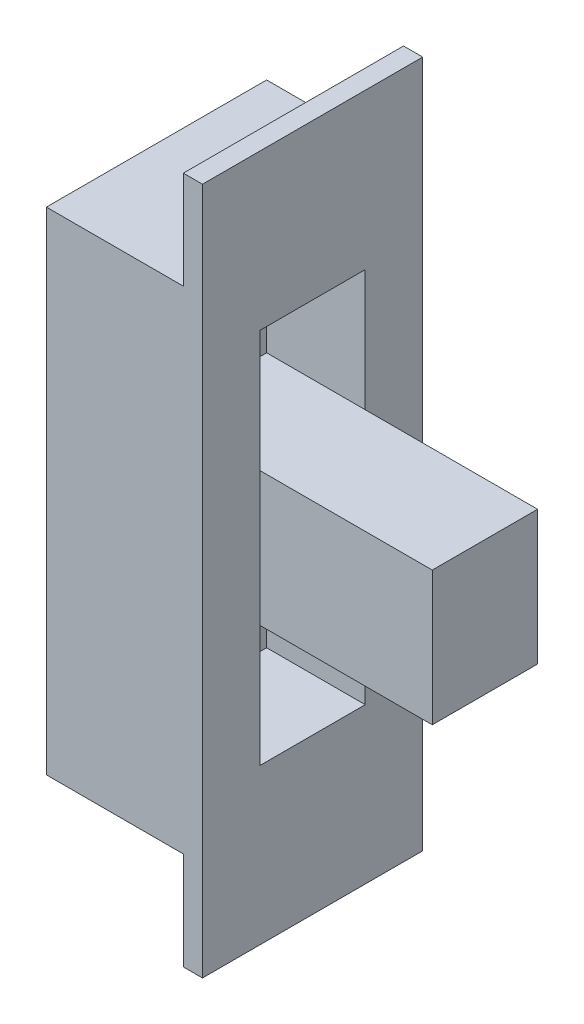
ISO-10303-21;
HEADER;
FILE_DESCRIPTION(('STEP AP214'),'2;1');
FILE_NAME('part.step','',(''),(''),'','','');
FILE_SCHEMA(('AUTOMOTIVE_DESIGN { 1 0 10303 214 1 1 1 1 }'));
ENDSEC;
DATA;
#1=APPLICATION_CONTEXT('core data for automotive mechanical design processes');
#2=APPLICATION_PROTOCOL_DEFINITION('international standard','automotive_design',2000,#1);
#3=PRODUCT_CONTEXT('',#1,'mechanical');
#4=PRODUCT('Part','Part','',(#3));
#5=PRODUCT_RELATED_PRODUCT_CATEGORY('part','',(#4));
#6=PRODUCT_DEFINITION_FORMATION('','',#4);
#7=PRODUCT_DEFINITION_CONTEXT('part definition',#1,'design');
#8=PRODUCT_DEFINITION('design','',#6,#7);
#9=PRODUCT_DEFINITION_SHAPE('','',#8);
#10=(LENGTH_UNIT() NAMED_UNIT(*) SI_UNIT(.MILLI.,.METRE.));
#11=(NAMED_UNIT(*) PLANE_ANGLE_UNIT() SI_UNIT($,.RADIAN.));
#12=(NAMED_UNIT(*) SI_UNIT($,.STERADIAN.) SOLID_ANGLE_UNIT());
#13=UNCERTAINTY_MEASURE_WITH_UNIT(LENGTH_MEASURE(1.E-05),#10,'distance_accuracy_value','');
#14=(GEOMETRIC_REPRESENTATION_CONTEXT(3) GLOBAL_UNCERTAINTY_ASSIGNED_CONTEXT((#13)) GLOBAL_UNIT_ASSIGNED_CONTEXT((#10,
#11,#12)) REPRESENTATION_CONTEXT('',''));
#15=CARTESIAN_POINT('',(0.,0.,0.));
#16=DIRECTION('',(0.,0.,1.));
#17=DIRECTION('',(1.,0.,0.));
#18=AXIS2_PLACEMENT_3D('',#15,#16,#17);
#19=CARTESIAN_POINT('',(-35.8250258301707,28.9408534637666,8.5));
#20=DIRECTION('',(0.,0.,-1.));
#21=DIRECTION('',(-1.,0.,0.));
#22=AXIS2_PLACEMENT_3D('',#19,#20,#21);
#23=PLANE('',#22);
#24=DIRECTION('',(0.,1.,0.));
#25=VECTOR('',#24,1.);
#26=CARTESIAN_POINT('',(-12.3925708076852,28.9408534637666,8.5));
#27=LINE('',#26,#25);
#28=CARTESIAN_POINT('',(-12.3925708076852,28.9408534637666,8.5));
#29=VERTEX_POINT('',#28);
#30=CARTESIAN_POINT('',(-12.3925708076852,35.2793865139848,8.5));
#31=VERTEX_POINT('',#30);
#32=EDGE_CURVE('E233',#29,#31,#27,.T.);
#33=ORIENTED_EDGE('',*,*,#32,.T.);
#34=DIRECTION('',(-1.,0.,0.));
#35=VECTOR('',#34,1.);
#36=CARTESIAN_POINT('',(10.6596760996972,35.2793865139848,8.5));
#37=LINE('',#36,#35);
#38=CARTESIAN_POINT('',(-7.24257080768518,35.2793865139848,8.5));
#39=VERTEX_POINT('',#38);
#40=EDGE_CURVE('E62',#39,#31,#37,.T.);
#41=ORIENTED_EDGE('',*,*,#40,.F.);
#42=DIRECTION('',(0.,1.,0.));
#43=VECTOR('',#42,1.);
#44=CARTESIAN_POINT('',(-7.24257080768518,28.9408534637666,8.5));
#45=LINE('',#44,#43);
#46=CARTESIAN_POINT('',(-7.24257080768518,28.9408534637666,8.5));
#47=VERTEX_POINT('',#46);
#48=EDGE_CURVE('E223',#47,#39,#45,.T.);
#49=ORIENTED_EDGE('',*,*,#48,.F.);
#50=DIRECTION('',(1.,0.,0.));
#51=VECTOR('',#50,1.);
#52=CARTESIAN_POINT('',(-35.8250258301707,28.9408534637666,8.5));
#53=LINE('',#52,#51);
#54=EDGE_CURVE('E228',#29,#47,#53,.T.);
#55=ORIENTED_EDGE('',*,*,#54,.F.);
#56=EDGE_LOOP('',(#33,#41,#49,#55));
#57=FACE_BOUND('',#56,.T.);
#58=ADVANCED_FACE('F39',(#57),#23,.T.);
#59=CARTESIAN_POINT('',(-35.8250258301707,48.6191465362334,3.));
#60=DIRECTION('',(0.,0.,1.));
#61=DIRECTION('',(1.,0.,0.));
#62=AXIS2_PLACEMENT_3D('',#59,#60,#61);
#63=PLANE('',#62);
#64=DIRECTION('',(0.,-1.,0.));
#65=VECTOR('',#64,1.);
#66=CARTESIAN_POINT('',(-7.24257080768518,48.6191465362334,3.));
#67=LINE('',#66,#65);
#68=CARTESIAN_POINT('',(-7.24257080768518,35.2793865139848,3.));
#69=VERTEX_POINT('',#68);
#70=CARTESIAN_POINT('',(-7.24257080768518,28.9408534637666,3.));
#71=VERTEX_POINT('',#70);
#72=EDGE_CURVE('E217',#69,#71,#67,.T.);
#73=ORIENTED_EDGE('',*,*,#72,.F.);
#74=DIRECTION('',(-1.,0.,0.));
#75=VECTOR('',#74,1.);
#76=CARTESIAN_POINT('',(10.6596760996972,35.2793865139848,3.));
#77=LINE('',#76,#75);
#78=CARTESIAN_POINT('',(-12.3925708076852,35.2793865139848,3.));
#79=VERTEX_POINT('',#78);
#80=EDGE_CURVE('E186',#69,#79,#77,.T.);
#81=ORIENTED_EDGE('',*,*,#80,.T.);
#82=DIRECTION('',(0.,-1.,0.));
#83=VECTOR('',#82,1.);
#84=CARTESIAN_POINT('',(-12.3925708076852,48.6191465362334,3.));
#85=LINE('',#84,#83);
#86=CARTESIAN_POINT('',(-12.3925708076852,28.9408534637666,3.));
#87=VERTEX_POINT('',#86);
#88=EDGE_CURVE('E216',#79,#87,#85,.T.);
#89=ORIENTED_EDGE('',*,*,#88,.T.);
#90=DIRECTION('',(1.,0.,0.));
#91=VECTOR('',#90,1.);
#92=CARTESIAN_POINT('',(-35.8250258301707,28.9408534637666,3.));
#93=LINE('',#92,#91);
#94=EDGE_CURVE('E212',#87,#71,#93,.T.);
#95=ORIENTED_EDGE('',*,*,#94,.T.);
#96=EDGE_LOOP('',(#73,#81,#89,#95));
#97=FACE_BOUND('',#96,.T.);
#98=ADVANCED_FACE('F366',(#97),#63,.T.);
#99=CARTESIAN_POINT('',(-12.3925708076852,25.9408534637666,0.));
#100=DIRECTION('',(-1.,0.,0.));
#101=DIRECTION('',(0.,0.,1.));
#102=AXIS2_PLACEMENT_3D('',#99,#100,#101);
#103=PLANE('',#102);
#104=DIRECTION('',(0.,0.,-1.));
#105=VECTOR('',#104,1.);
#106=CARTESIAN_POINT('',(-12.3925708076852,35.2793865139848,8.5));
#107=LINE('',#106,#105);
#108=EDGE_CURVE('E198',#31,#79,#107,.T.);
#109=ORIENTED_EDGE('',*,*,#108,.F.);
#110=ORIENTED_EDGE('',*,*,#32,.F.);
#111=DIRECTION('',(0.,0.,1.));
#112=VECTOR('',#111,1.);
#113=CARTESIAN_POINT('',(-12.3925708076852,28.9408534637666,3.));
#114=LINE('',#113,#112);
#115=EDGE_CURVE('E236',#87,#29,#114,.T.);
#116=ORIENTED_EDGE('',*,*,#115,.F.);
#117=ORIENTED_EDGE('',*,*,#88,.F.);
#118=EDGE_LOOP('',(#109,#110,#116,#117));
#119=FACE_BOUND('',#118,.T.);
#120=ADVANCED_FACE('F339',(#119),#103,.F.);
#121=CARTESIAN_POINT('',(-7.24257080768518,56.73,11.5));
#122=DIRECTION('',(1.,0.,0.));
#123=DIRECTION('',(0.,0.,-1.));
#124=AXIS2_PLACEMENT_3D('',#121,#122,#123);
#125=PLANE('',#124);
#126=DIRECTION('',(0.,-1.,0.));
#127=VECTOR('',#126,1.);
#128=CARTESIAN_POINT('',(-7.24257080768518,56.73,0.));
#129=LINE('',#128,#127);
#130=CARTESIAN_POINT('',(-7.24257080768518,56.73,0.));
#131=VERTEX_POINT('',#130);
#132=CARTESIAN_POINT('',(-7.24257080768518,20.83,0.));
#133=VERTEX_POINT('',#132);
#134=EDGE_CURVE('E278',#131,#133,#129,.T.);
#135=ORIENTED_EDGE('',*,*,#134,.F.);
#136=DIRECTION('',(0.,0.,-1.));
#137=VECTOR('',#136,1.);
#138=CARTESIAN_POINT('',(-7.24257080768518,56.73,11.5));
#139=LINE('',#138,#137);
#140=CARTESIAN_POINT('',(-7.24257080768518,56.73,11.5));
#141=VERTEX_POINT('',#140);
#142=EDGE_CURVE('E286',#141,#131,#139,.T.);
#143=ORIENTED_EDGE('',*,*,#142,.F.);
#144=DIRECTION('',(0.,-1.,0.));
#145=VECTOR('',#144,1.);
#146=CARTESIAN_POINT('',(-7.24257080768518,56.73,11.5));
#147=LINE('',#146,#145);
#148=CARTESIAN_POINT('',(-7.24257080768518,20.83,11.5));
#149=VERTEX_POINT('',#148);
#150=EDGE_CURVE('E283',#141,#149,#147,.T.);
#151=ORIENTED_EDGE('',*,*,#150,.T.);
#152=DIRECTION('',(0.,0.,-1.));
#153=VECTOR('',#152,1.);
#154=CARTESIAN_POINT('',(-7.24257080768518,20.83,11.5));
#155=LINE('',#154,#153);
#156=EDGE_CURVE('E299',#149,#133,#155,.T.);
#157=ORIENTED_EDGE('',*,*,#156,.T.);
#158=EDGE_LOOP('',(#135,#143,#151,#157));
#159=FACE_BOUND('',#158,.T.);
#160=CARTESIAN_POINT('',(-7.24257080768518,48.6191465362334,3.));
#161=VERTEX_POINT('',#160);
#162=CARTESIAN_POINT('',(-7.24257080768518,42.2793865139848,3.));
#163=VERTEX_POINT('',#162);
#164=EDGE_CURVE('E213',#161,#163,#67,.T.);
#165=ORIENTED_EDGE('',*,*,#164,.T.);
#166=DIRECTION('',(0.,-1.,0.));
#167=VECTOR('',#166,1.);
#168=CARTESIAN_POINT('',(-7.24257080768518,56.73,3.));
#169=LINE('',#168,#167);
#170=EDGE_CURVE('E183',#163,#69,#169,.T.);
#171=ORIENTED_EDGE('',*,*,#170,.T.);
#172=ORIENTED_EDGE('',*,*,#72,.T.);
#173=DIRECTION('',(0.,0.,1.));
#174=VECTOR('',#173,1.);
#175=CARTESIAN_POINT('',(-7.24257080768518,28.9408534637666,3.));
#176=LINE('',#175,#174);
#177=EDGE_CURVE('E225',#71,#47,#176,.T.);
#178=ORIENTED_EDGE('',*,*,#177,.T.);
#179=ORIENTED_EDGE('',*,*,#48,.T.);
#180=DIRECTION('',(0.,1.,0.));
#181=VECTOR('',#180,1.);
#182=CARTESIAN_POINT('',(-7.24257080768518,56.73,8.5));
#183=LINE('',#182,#181);
#184=CARTESIAN_POINT('',(-7.24257080768518,42.2793865139848,8.5));
#185=VERTEX_POINT('',#184);
#186=EDGE_CURVE('E208',#39,#185,#183,.T.);
#187=ORIENTED_EDGE('',*,*,#186,.T.);
#188=CARTESIAN_POINT('',(-7.24257080768518,48.6191465362334,8.5));
#189=VERTEX_POINT('',#188);
#190=EDGE_CURVE('E54',#185,#189,#45,.T.);
#191=ORIENTED_EDGE('',*,*,#190,.T.);
#192=DIRECTION('',(0.,0.,-1.));
#193=VECTOR('',#192,1.);
#194=CARTESIAN_POINT('',(-7.24257080768518,48.6191465362334,8.5));
#195=LINE('',#194,#193);
#196=EDGE_CURVE('E218',#189,#161,#195,.T.);
#197=ORIENTED_EDGE('',*,*,#196,.T.);
#198=EDGE_LOOP('',(#165,#171,#172,#178,#179,#187,#191,#197));
#199=FACE_BOUND('',#198,.T.);
#200=ADVANCED_FACE('F336',(#159,#199),#125,.T.);
#201=CARTESIAN_POINT('',(-8.24257080768518,20.83,11.5));
#202=DIRECTION('',(-1.,0.,0.));
#203=DIRECTION('',(0.,0.,1.));
#204=AXIS2_PLACEMENT_3D('',#201,#202,#203);
#205=PLANE('',#204);
#206=DIRECTION('',(0.,1.,0.));
#207=VECTOR('',#206,1.);
#208=CARTESIAN_POINT('',(-8.24257080768518,20.83,0.));
#209=LINE('',#208,#207);
#210=CARTESIAN_POINT('',(-8.24257080768518,51.6191465362334,0.));
#211=VERTEX_POINT('',#210);
#212=CARTESIAN_POINT('',(-8.24257080768518,56.73,0.));
#213=VERTEX_POINT('',#212);
#214=EDGE_CURVE('E289',#211,#213,#209,.T.);
#215=ORIENTED_EDGE('',*,*,#214,.F.);
#216=DIRECTION('',(0.,0.,1.));
#217=VECTOR('',#216,1.);
#218=CARTESIAN_POINT('',(-8.24257080768518,51.6191465362334,0.));
#219=LINE('',#218,#217);
#220=CARTESIAN_POINT('',(-8.24257080768518,51.6191465362334,11.5));
#221=VERTEX_POINT('',#220);
#222=EDGE_CURVE('E251',#211,#221,#219,.T.);
#223=ORIENTED_EDGE('',*,*,#222,.T.);
#224=DIRECTION('',(0.,1.,0.));
#225=VECTOR('',#224,1.);
#226=CARTESIAN_POINT('',(-8.24257080768518,20.83,11.5));
#227=LINE('',#226,#225);
#228=CARTESIAN_POINT('',(-8.24257080768518,56.73,11.5));
#229=VERTEX_POINT('',#228);
#230=EDGE_CURVE('E277',#221,#229,#227,.T.);
#231=ORIENTED_EDGE('',*,*,#230,.T.);
#232=DIRECTION('',(0.,0.,-1.));
#233=VECTOR('',#232,1.);
#234=CARTESIAN_POINT('',(-8.24257080768518,56.73,11.5));
#235=LINE('',#234,#233);
#236=EDGE_CURVE('E12',#229,#213,#235,.T.);
#237=ORIENTED_EDGE('',*,*,#236,.T.);
#238=EDGE_LOOP('',(#215,#223,#231,#237));
#239=FACE_BOUND('',#238,.T.);
#240=ADVANCED_FACE('F330',(#239),#205,.T.);
#241=CARTESIAN_POINT('',(-7.24257080768518,56.73,11.5));
#242=DIRECTION('',(0.,-1.,0.));
#243=DIRECTION('',(0.,0.,-1.));
#244=AXIS2_PLACEMENT_3D('',#241,#242,#243);
#245=PLANE('',#244);
#246=DIRECTION('',(-1.,0.,0.));
#247=VECTOR('',#246,1.);
#248=CARTESIAN_POINT('',(-7.24257080768518,56.73,0.));
#249=LINE('',#248,#247);
#250=EDGE_CURVE('E273',#131,#213,#249,.T.);
#251=ORIENTED_EDGE('',*,*,#250,.T.);
#252=ORIENTED_EDGE('',*,*,#236,.F.);
#253=DIRECTION('',(-1.,0.,0.));
#254=VECTOR('',#253,1.);
#255=CARTESIAN_POINT('',(-7.24257080768518,56.73,11.5));
#256=LINE('',#255,#254);
#257=EDGE_CURVE('E274',#141,#229,#256,.T.);
#258=ORIENTED_EDGE('',*,*,#257,.F.);
#259=ORIENTED_EDGE('',*,*,#142,.T.);
#260=EDGE_LOOP('',(#251,#252,#258,#259));
#261=FACE_BOUND('',#260,.T.);
#262=ADVANCED_FACE('F41',(#261),#245,.F.);
#263=DIRECTION('',(0.,0.,1.));
#264=VECTOR('',#263,1.);
#265=CARTESIAN_POINT('',(-8.24257080768518,25.9408534637666,0.));
#266=LINE('',#265,#264);
#267=CARTESIAN_POINT('',(-8.24257080768518,25.9408534637666,0.));
#268=VERTEX_POINT('',#267);
#269=CARTESIAN_POINT('',(-8.24257080768518,25.9408534637666,11.5));
#270=VERTEX_POINT('',#269);
#271=EDGE_CURVE('E232',#268,#270,#266,.T.);
#272=ORIENTED_EDGE('',*,*,#271,.F.);
#273=CARTESIAN_POINT('',(-8.24257080768518,20.83,0.));
#274=VERTEX_POINT('',#273);
#275=EDGE_CURVE('E290',#274,#268,#209,.T.);
#276=ORIENTED_EDGE('',*,*,#275,.F.);
#277=DIRECTION('',(0.,0.,-1.));
#278=VECTOR('',#277,1.);
#279=CARTESIAN_POINT('',(-8.24257080768518,20.83,11.5));
#280=LINE('',#279,#278);
#281=CARTESIAN_POINT('',(-8.24257080768518,20.83,11.5));
#282=VERTEX_POINT('',#281);
#283=EDGE_CURVE('E47',#282,#274,#280,.T.);
#284=ORIENTED_EDGE('',*,*,#283,.F.);
#285=EDGE_CURVE('E279',#282,#270,#227,.T.);
#286=ORIENTED_EDGE('',*,*,#285,.T.);
#287=EDGE_LOOP('',(#272,#276,#284,#286));
#288=FACE_BOUND('',#287,.T.);
#289=ADVANCED_FACE('F313',(#288),#205,.T.);
#290=CARTESIAN_POINT('',(-8.24257080768518,20.83,11.5));
#291=DIRECTION('',(0.,1.,0.));
#292=DIRECTION('',(0.,0.,1.));
#293=AXIS2_PLACEMENT_3D('',#290,#291,#292);
#294=PLANE('',#293);
#295=DIRECTION('',(1.,0.,0.));
#296=VECTOR('',#295,1.);
#297=CARTESIAN_POINT('',(-8.24257080768518,20.83,0.));
#298=LINE('',#297,#296);
#299=EDGE_CURVE('E293',#274,#133,#298,.T.);
#300=ORIENTED_EDGE('',*,*,#299,.T.);
#301=ORIENTED_EDGE('',*,*,#156,.F.);
#302=DIRECTION('',(1.,0.,0.));
#303=VECTOR('',#302,1.);
#304=CARTESIAN_POINT('',(-8.24257080768518,20.83,11.5));
#305=LINE('',#304,#303);
#306=EDGE_CURVE('E281',#282,#149,#305,.T.);
#307=ORIENTED_EDGE('',*,*,#306,.F.);
#308=ORIENTED_EDGE('',*,*,#283,.T.);
#309=EDGE_LOOP('',(#300,#301,#307,#308));
#310=FACE_BOUND('',#309,.T.);
#311=ADVANCED_FACE('F303',(#310),#294,.F.);
#312=CARTESIAN_POINT('',(-8.24257080768518,56.73,11.5));
#313=DIRECTION('',(0.,0.,-1.));
#314=DIRECTION('',(-1.,0.,0.));
#315=AXIS2_PLACEMENT_3D('',#312,#313,#314);
#316=PLANE('',#315);
#317=ORIENTED_EDGE('',*,*,#257,.T.);
#318=ORIENTED_EDGE('',*,*,#230,.F.);
#319=DIRECTION('',(1.,0.,0.));
#320=VECTOR('',#319,1.);
#321=CARTESIAN_POINT('',(-15.3925708076852,51.6191465362334,11.5));
#322=LINE('',#321,#320);
#323=CARTESIAN_POINT('',(-15.3925708076852,51.6191465362334,11.5));
#324=VERTEX_POINT('',#323);
#325=EDGE_CURVE('E264',#324,#221,#322,.T.);
#326=ORIENTED_EDGE('',*,*,#325,.F.);
#327=DIRECTION('',(0.,1.,0.));
#328=VECTOR('',#327,1.);
#329=CARTESIAN_POINT('',(-15.3925708076852,25.9408534637666,11.5));
#330=LINE('',#329,#328);
#331=CARTESIAN_POINT('',(-15.3925708076852,25.9408534637666,11.5));
#332=VERTEX_POINT('',#331);
#333=EDGE_CURVE('E253',#332,#324,#330,.T.);
#334=ORIENTED_EDGE('',*,*,#333,.F.);
#335=DIRECTION('',(1.,0.,0.));
#336=VECTOR('',#335,1.);
#337=CARTESIAN_POINT('',(-15.3925708076852,25.9408534637666,11.5));
#338=LINE('',#337,#336);
#339=EDGE_CURVE('E267',#332,#270,#338,.T.);
#340=ORIENTED_EDGE('',*,*,#339,.T.);
#341=ORIENTED_EDGE('',*,*,#285,.F.);
#342=ORIENTED_EDGE('',*,*,#306,.T.);
#343=ORIENTED_EDGE('',*,*,#150,.F.);
#344=EDGE_LOOP('',(#317,#318,#326,#334,#340,#341,#342,#343));
#345=FACE_BOUND('',#344,.T.);
#346=ADVANCED_FACE('F319',(#345),#316,.F.);
#347=CARTESIAN_POINT('',(-8.24257080768518,56.73,0.));
#348=DIRECTION('',(0.,0.,-1.));
#349=DIRECTION('',(-1.,0.,0.));
#350=AXIS2_PLACEMENT_3D('',#347,#348,#349);
#351=PLANE('',#350);
#352=ORIENTED_EDGE('',*,*,#250,.F.);
#353=ORIENTED_EDGE('',*,*,#134,.T.);
#354=ORIENTED_EDGE('',*,*,#299,.F.);
#355=ORIENTED_EDGE('',*,*,#275,.T.);
#356=DIRECTION('',(1.,0.,0.));
#357=VECTOR('',#356,1.);
#358=CARTESIAN_POINT('',(-15.3925708076852,25.9408534637666,0.));
#359=LINE('',#358,#357);
#360=CARTESIAN_POINT('',(-15.3925708076852,25.9408534637666,0.));
#361=VERTEX_POINT('',#360);
#362=EDGE_CURVE('E270',#361,#268,#359,.T.);
#363=ORIENTED_EDGE('',*,*,#362,.F.);
#364=DIRECTION('',(0.,-1.,0.));
#365=VECTOR('',#364,1.);
#366=CARTESIAN_POINT('',(-15.3925708076852,51.6191465362334,0.));
#367=LINE('',#366,#365);
#368=CARTESIAN_POINT('',(-15.3925708076852,51.6191465362334,0.));
#369=VERTEX_POINT('',#368);
#370=EDGE_CURVE('E247',#369,#361,#367,.T.);
#371=ORIENTED_EDGE('',*,*,#370,.F.);
#372=DIRECTION('',(1.,0.,0.));
#373=VECTOR('',#372,1.);
#374=CARTESIAN_POINT('',(-15.3925708076852,51.6191465362334,0.));
#375=LINE('',#374,#373);
#376=EDGE_CURVE('E258',#369,#211,#375,.T.);
#377=ORIENTED_EDGE('',*,*,#376,.T.);
#378=ORIENTED_EDGE('',*,*,#214,.T.);
#379=EDGE_LOOP('',(#352,#353,#354,#355,#363,#371,#377,#378));
#380=FACE_BOUND('',#379,.T.);
#381=ADVANCED_FACE('F310',(#380),#351,.T.);
#382=CARTESIAN_POINT('',(-15.3925708076852,25.9408534637666,0.));
#383=DIRECTION('',(0.,1.,0.));
#384=DIRECTION('',(0.,0.,1.));
#385=AXIS2_PLACEMENT_3D('',#382,#383,#384);
#386=PLANE('',#385);
#387=ORIENTED_EDGE('',*,*,#271,.T.);
#388=ORIENTED_EDGE('',*,*,#339,.F.);
#389=DIRECTION('',(0.,0.,1.));
#390=VECTOR('',#389,1.);
#391=CARTESIAN_POINT('',(-15.3925708076852,25.9408534637666,0.));
#392=LINE('',#391,#390);
#393=EDGE_CURVE('E250',#361,#332,#392,.T.);
#394=ORIENTED_EDGE('',*,*,#393,.F.);
#395=ORIENTED_EDGE('',*,*,#362,.T.);
#396=EDGE_LOOP('',(#387,#388,#394,#395));
#397=FACE_BOUND('',#396,.T.);
#398=ADVANCED_FACE('F316',(#397),#386,.F.);
#399=CARTESIAN_POINT('',(-15.3925708076852,51.6191465362334,0.));
#400=DIRECTION('',(0.,1.,0.));
#401=DIRECTION('',(0.,0.,1.));
#402=AXIS2_PLACEMENT_3D('',#399,#400,#401);
#403=PLANE('',#402);
#404=ORIENTED_EDGE('',*,*,#222,.F.);
#405=ORIENTED_EDGE('',*,*,#376,.F.);
#406=DIRECTION('',(0.,0.,1.));
#407=VECTOR('',#406,1.);
#408=CARTESIAN_POINT('',(-15.3925708076852,51.6191465362334,0.));
#409=LINE('',#408,#407);
#410=EDGE_CURVE('E255',#369,#324,#409,.T.);
#411=ORIENTED_EDGE('',*,*,#410,.T.);
#412=ORIENTED_EDGE('',*,*,#325,.T.);
#413=EDGE_LOOP('',(#404,#405,#411,#412));
#414=FACE_BOUND('',#413,.T.);
#415=ADVANCED_FACE('F328',(#414),#403,.T.);
#416=CARTESIAN_POINT('',(-15.3925708076852,25.9408534637666,0.));
#417=DIRECTION('',(-1.,0.,0.));
#418=DIRECTION('',(0.,0.,1.));
#419=AXIS2_PLACEMENT_3D('',#416,#417,#418);
#420=PLANE('',#419);
#421=ORIENTED_EDGE('',*,*,#370,.T.);
#422=ORIENTED_EDGE('',*,*,#393,.T.);
#423=ORIENTED_EDGE('',*,*,#333,.T.);
#424=ORIENTED_EDGE('',*,*,#410,.F.);
#425=EDGE_LOOP('',(#421,#422,#423,#424));
#426=FACE_BOUND('',#425,.T.);
#427=ADVANCED_FACE('F324',(#426),#420,.T.);
#428=CARTESIAN_POINT('',(-35.8250258301707,28.9408534637666,3.));
#429=DIRECTION('',(0.,1.,0.));
#430=DIRECTION('',(0.,0.,1.));
#431=AXIS2_PLACEMENT_3D('',#428,#429,#430);
#432=PLANE('',#431);
#433=ORIENTED_EDGE('',*,*,#115,.T.);
#434=ORIENTED_EDGE('',*,*,#54,.T.);
#435=ORIENTED_EDGE('',*,*,#177,.F.);
#436=ORIENTED_EDGE('',*,*,#94,.F.);
#437=EDGE_LOOP('',(#433,#434,#435,#436));
#438=FACE_BOUND('',#437,.T.);
#439=ADVANCED_FACE('F364',(#438),#432,.T.);
#440=DIRECTION('',(-1.,0.,0.));
#441=VECTOR('',#440,1.);
#442=CARTESIAN_POINT('',(10.6596760996972,42.2793865139848,8.5));
#443=LINE('',#442,#441);
#444=CARTESIAN_POINT('',(-12.3925708076852,42.2793865139848,8.5));
#445=VERTEX_POINT('',#444);
#446=EDGE_CURVE('E209',#185,#445,#443,.T.);
#447=ORIENTED_EDGE('',*,*,#446,.T.);
#448=CARTESIAN_POINT('',(-12.3925708076852,48.6191465362334,8.5));
#449=VERTEX_POINT('',#448);
#450=EDGE_CURVE('E235',#445,#449,#27,.T.);
#451=ORIENTED_EDGE('',*,*,#450,.T.);
#452=DIRECTION('',(1.,0.,0.));
#453=VECTOR('',#452,1.);
#454=CARTESIAN_POINT('',(-35.8250258301707,48.6191465362334,8.5));
#455=LINE('',#454,#453);
#456=EDGE_CURVE('E222',#449,#189,#455,.T.);
#457=ORIENTED_EDGE('',*,*,#456,.T.);
#458=ORIENTED_EDGE('',*,*,#190,.F.);
#459=EDGE_LOOP('',(#447,#451,#457,#458));
#460=FACE_BOUND('',#459,.T.);
#461=ADVANCED_FACE('F353',(#460),#23,.T.);
#462=CARTESIAN_POINT('',(-35.8250258301707,48.6191465362334,8.5));
#463=DIRECTION('',(0.,-1.,0.));
#464=DIRECTION('',(0.,0.,-1.));
#465=AXIS2_PLACEMENT_3D('',#462,#463,#464);
#466=PLANE('',#465);
#467=DIRECTION('',(0.,0.,-1.));
#468=VECTOR('',#467,1.);
#469=CARTESIAN_POINT('',(-12.3925708076852,48.6191465362334,8.5));
#470=LINE('',#469,#468);
#471=CARTESIAN_POINT('',(-12.3925708076852,48.6191465362334,3.));
#472=VERTEX_POINT('',#471);
#473=EDGE_CURVE('E229',#449,#472,#470,.T.);
#474=ORIENTED_EDGE('',*,*,#473,.T.);
#475=DIRECTION('',(1.,0.,0.));
#476=VECTOR('',#475,1.);
#477=CARTESIAN_POINT('',(-35.8250258301707,48.6191465362334,3.));
#478=LINE('',#477,#476);
#479=EDGE_CURVE('E221',#472,#161,#478,.T.);
#480=ORIENTED_EDGE('',*,*,#479,.T.);
#481=ORIENTED_EDGE('',*,*,#196,.F.);
#482=ORIENTED_EDGE('',*,*,#456,.F.);
#483=EDGE_LOOP('',(#474,#480,#481,#482));
#484=FACE_BOUND('',#483,.T.);
#485=ADVANCED_FACE('F386',(#484),#466,.T.);
#486=DIRECTION('',(-1.,0.,0.));
#487=VECTOR('',#486,1.);
#488=CARTESIAN_POINT('',(10.6596760996972,42.2793865139848,3.));
#489=LINE('',#488,#487);
#490=CARTESIAN_POINT('',(-12.3925708076852,42.2793865139848,3.));
#491=VERTEX_POINT('',#490);
#492=EDGE_CURVE('E187',#163,#491,#489,.T.);
#493=ORIENTED_EDGE('',*,*,#492,.F.);
#494=ORIENTED_EDGE('',*,*,#164,.F.);
#495=ORIENTED_EDGE('',*,*,#479,.F.);
#496=EDGE_CURVE('E239',#472,#491,#85,.T.);
#497=ORIENTED_EDGE('',*,*,#496,.T.);
#498=EDGE_LOOP('',(#493,#494,#495,#497));
#499=FACE_BOUND('',#498,.T.);
#500=ADVANCED_FACE('F345',(#499),#63,.T.);
#501=ORIENTED_EDGE('',*,*,#450,.F.);
#502=DIRECTION('',(0.,0.,-1.));
#503=VECTOR('',#502,1.);
#504=CARTESIAN_POINT('',(-12.3925708076852,42.2793865139848,8.5));
#505=LINE('',#504,#503);
#506=EDGE_CURVE('E176',#445,#491,#505,.T.);
#507=ORIENTED_EDGE('',*,*,#506,.T.);
#508=ORIENTED_EDGE('',*,*,#496,.F.);
#509=ORIENTED_EDGE('',*,*,#473,.F.);
#510=EDGE_LOOP('',(#501,#507,#508,#509));
#511=FACE_BOUND('',#510,.T.);
#512=ADVANCED_FACE('F350',(#511),#103,.F.);
#513=CARTESIAN_POINT('',(1.75742919231482,56.73,11.5));
#514=DIRECTION('',(1.,0.,0.));
#515=DIRECTION('',(0.,0.,-1.));
#516=AXIS2_PLACEMENT_3D('',#513,#514,#515);
#517=PLANE('',#516);
#518=DIRECTION('',(0.,0.,-1.));
#519=VECTOR('',#518,1.);
#520=CARTESIAN_POINT('',(1.75742919231482,42.2793865139848,8.5));
#521=LINE('',#520,#519);
#522=CARTESIAN_POINT('',(1.75742919231482,42.2793865139848,8.5));
#523=VERTEX_POINT('',#522);
#524=CARTESIAN_POINT('',(1.75742919231482,42.2793865139848,3.));
#525=VERTEX_POINT('',#524);
#526=EDGE_CURVE('E169',#523,#525,#521,.T.);
#527=ORIENTED_EDGE('',*,*,#526,.F.);
#528=DIRECTION('',(0.,-1.,0.));
#529=VECTOR('',#528,1.);
#530=CARTESIAN_POINT('',(1.75742919231482,42.2793865139848,8.5));
#531=LINE('',#530,#529);
#532=CARTESIAN_POINT('',(1.75742919231482,35.2793865139848,8.5));
#533=VERTEX_POINT('',#532);
#534=EDGE_CURVE('E199',#523,#533,#531,.T.);
#535=ORIENTED_EDGE('',*,*,#534,.T.);
#536=DIRECTION('',(0.,0.,-1.));
#537=VECTOR('',#536,1.);
#538=CARTESIAN_POINT('',(1.75742919231482,35.2793865139848,8.5));
#539=LINE('',#538,#537);
#540=CARTESIAN_POINT('',(1.75742919231482,35.2793865139848,3.));
#541=VERTEX_POINT('',#540);
#542=EDGE_CURVE('E172',#533,#541,#539,.T.);
#543=ORIENTED_EDGE('',*,*,#542,.T.);
#544=DIRECTION('',(0.,1.,0.));
#545=VECTOR('',#544,1.);
#546=CARTESIAN_POINT('',(1.75742919231482,35.2793865139848,3.));
#547=LINE('',#546,#545);
#548=EDGE_CURVE('E165',#541,#525,#547,.T.);
#549=ORIENTED_EDGE('',*,*,#548,.T.);
#550=EDGE_LOOP('',(#527,#535,#543,#549));
#551=FACE_BOUND('',#550,.T.);
#552=ADVANCED_FACE('F167',(#551),#517,.T.);
#553=CARTESIAN_POINT('',(10.6596760996972,42.2793865139848,8.5));
#554=DIRECTION('',(0.,1.,0.));
#555=DIRECTION('',(0.,0.,1.));
#556=AXIS2_PLACEMENT_3D('',#553,#554,#555);
#557=PLANE('',#556);
#558=EDGE_CURVE('E193',#523,#185,#443,.T.);
#559=ORIENTED_EDGE('',*,*,#558,.F.);
#560=ORIENTED_EDGE('',*,*,#526,.T.);
#561=EDGE_CURVE('E180',#525,#163,#489,.T.);
#562=ORIENTED_EDGE('',*,*,#561,.T.);
#563=ORIENTED_EDGE('',*,*,#492,.T.);
#564=ORIENTED_EDGE('',*,*,#506,.F.);
#565=ORIENTED_EDGE('',*,*,#446,.F.);
#566=EDGE_LOOP('',(#559,#560,#562,#563,#564,#565));
#567=FACE_BOUND('',#566,.T.);
#568=ADVANCED_FACE('F190',(#567),#557,.T.);
#569=CARTESIAN_POINT('',(10.6596760996972,35.2793865139848,3.));
#570=DIRECTION('',(0.,0.,1.));
#571=DIRECTION('',(1.,0.,0.));
#572=AXIS2_PLACEMENT_3D('',#569,#570,#571);
#573=PLANE('',#572);
#574=ORIENTED_EDGE('',*,*,#170,.F.);
#575=ORIENTED_EDGE('',*,*,#561,.F.);
#576=ORIENTED_EDGE('',*,*,#548,.F.);
#577=EDGE_CURVE('E205',#541,#69,#77,.T.);
#578=ORIENTED_EDGE('',*,*,#577,.T.);
#579=EDGE_LOOP('',(#574,#575,#576,#578));
#580=FACE_BOUND('',#579,.T.);
#581=ADVANCED_FACE('F181',(#580),#573,.F.);
#582=CARTESIAN_POINT('',(10.6596760996972,35.2793865139848,8.5));
#583=DIRECTION('',(0.,1.,0.));
#584=DIRECTION('',(0.,0.,1.));
#585=AXIS2_PLACEMENT_3D('',#582,#583,#584);
#586=PLANE('',#585);
#587=ORIENTED_EDGE('',*,*,#542,.F.);
#588=EDGE_CURVE('E202',#533,#39,#37,.T.);
#589=ORIENTED_EDGE('',*,*,#588,.T.);
#590=ORIENTED_EDGE('',*,*,#40,.T.);
#591=ORIENTED_EDGE('',*,*,#108,.T.);
#592=ORIENTED_EDGE('',*,*,#80,.F.);
#593=ORIENTED_EDGE('',*,*,#577,.F.);
#594=EDGE_LOOP('',(#587,#589,#590,#591,#592,#593));
#595=FACE_BOUND('',#594,.T.);
#596=ADVANCED_FACE('F356',(#595),#586,.F.);
#597=CARTESIAN_POINT('',(10.6596760996972,42.2793865139848,8.5));
#598=DIRECTION('',(0.,0.,-1.));
#599=DIRECTION('',(-1.,0.,0.));
#600=AXIS2_PLACEMENT_3D('',#597,#598,#599);
#601=PLANE('',#600);
#602=ORIENTED_EDGE('',*,*,#186,.F.);
#603=ORIENTED_EDGE('',*,*,#588,.F.);
#604=ORIENTED_EDGE('',*,*,#534,.F.);
#605=ORIENTED_EDGE('',*,*,#558,.T.);
#606=EDGE_LOOP('',(#602,#603,#604,#605));
#607=FACE_BOUND('',#606,.T.);
#608=ADVANCED_FACE('F370',(#607),#601,.F.);
#609=CLOSED_SHELL('',(#58,#98,#120,#200,#240,#262,#289,#311,#346,#381,#398,#415,#427,#439,#461,
#485,#500,#512,#552,#568,#581,#596,#608));
#610=MANIFOLD_SOLID_BREP('B2',#609);
#611=ADVANCED_BREP_SHAPE_REPRESENTATION('',(#18,#610),#14);
#612=SHAPE_DEFINITION_REPRESENTATION(#9,#611);
ENDSEC;
END-ISO-10303-21;
